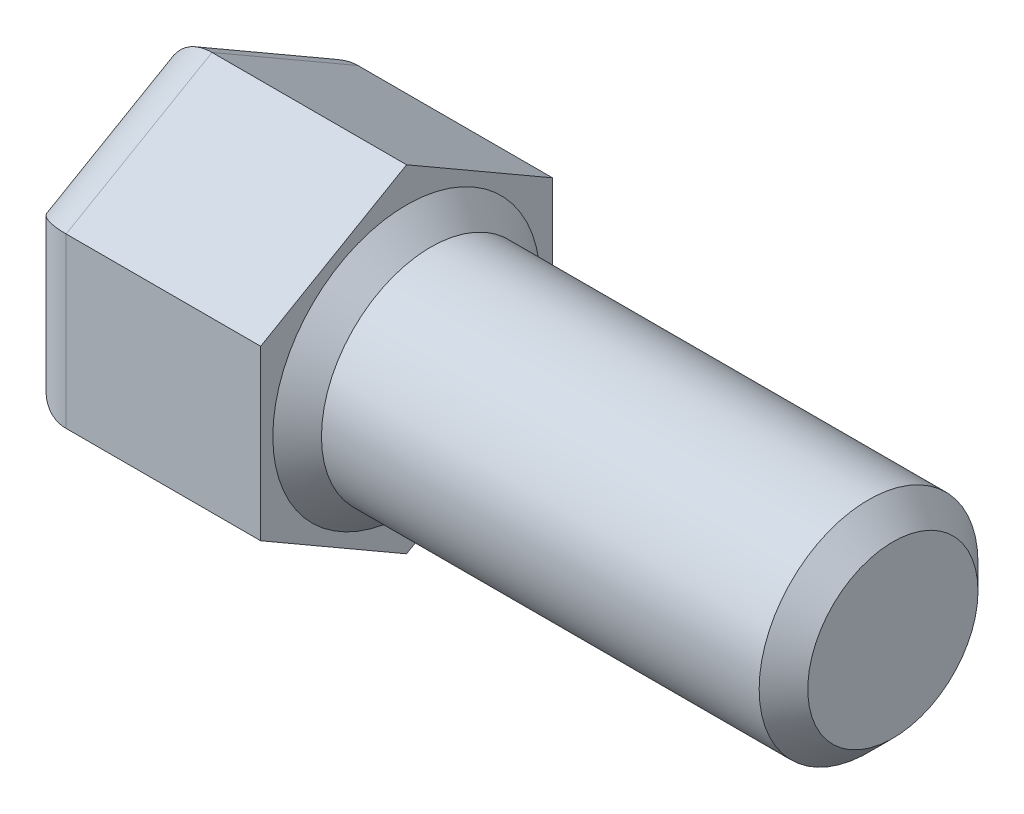
ISO-10303-21;
HEADER;
FILE_DESCRIPTION(('STEP AP214'),'2;1');
FILE_NAME('part.step','',(''),(''),'','','');
FILE_SCHEMA(('AUTOMOTIVE_DESIGN { 1 0 10303 214 1 1 1 1 }'));
ENDSEC;
DATA;
#1=APPLICATION_CONTEXT('core data for automotive mechanical design processes');
#2=APPLICATION_PROTOCOL_DEFINITION('international standard','automotive_design',2000,#1);
#3=PRODUCT_CONTEXT('',#1,'mechanical');
#4=PRODUCT('Part','Part','',(#3));
#5=PRODUCT_RELATED_PRODUCT_CATEGORY('part','',(#4));
#6=PRODUCT_DEFINITION_FORMATION('','',#4);
#7=PRODUCT_DEFINITION_CONTEXT('part definition',#1,'design');
#8=PRODUCT_DEFINITION('design','',#6,#7);
#9=PRODUCT_DEFINITION_SHAPE('','',#8);
#10=(LENGTH_UNIT() NAMED_UNIT(*) SI_UNIT(.MILLI.,.METRE.));
#11=(NAMED_UNIT(*) PLANE_ANGLE_UNIT() SI_UNIT($,.RADIAN.));
#12=(NAMED_UNIT(*) SI_UNIT($,.STERADIAN.) SOLID_ANGLE_UNIT());
#13=UNCERTAINTY_MEASURE_WITH_UNIT(LENGTH_MEASURE(1.E-05),#10,'distance_accuracy_value','');
#14=(GEOMETRIC_REPRESENTATION_CONTEXT(3) GLOBAL_UNCERTAINTY_ASSIGNED_CONTEXT((#13)) GLOBAL_UNIT_ASSIGNED_CONTEXT((#10,
#11,#12)) REPRESENTATION_CONTEXT('',''));
#15=CARTESIAN_POINT('',(0.,0.,0.));
#16=DIRECTION('',(0.,0.,1.));
#17=DIRECTION('',(1.,0.,0.));
#18=AXIS2_PLACEMENT_3D('',#15,#16,#17);
#19=CARTESIAN_POINT('',(10.,3.46410161513776,6.));
#20=DIRECTION('',(0.,-0.866025403784439,-0.5));
#21=DIRECTION('',(0.,0.5,-0.866025403784439));
#22=AXIS2_PLACEMENT_3D('',#19,#20,#21);
#23=PLANE('',#22);
#24=DIRECTION('',(-1.,0.,0.));
#25=VECTOR('',#24,1.);
#26=CARTESIAN_POINT('',(10.,6.92820323027551,0.));
#27=LINE('',#26,#25);
#28=CARTESIAN_POINT('',(10.,6.92820323027551,0.));
#29=VERTEX_POINT('',#28);
#30=CARTESIAN_POINT('',(2.,6.92820323027551,0.));
#31=VERTEX_POINT('',#30);
#32=EDGE_CURVE('E257',#29,#31,#27,.T.);
#33=ORIENTED_EDGE('',*,*,#32,.T.);
#34=DIRECTION('',(0.,-0.5,0.866025403784439));
#35=VECTOR('',#34,1.);
#36=CARTESIAN_POINT('',(2.,3.46410161513776,6.));
#37=LINE('',#36,#35);
#38=CARTESIAN_POINT('',(2.,3.46410161513776,6.));
#39=VERTEX_POINT('',#38);
#40=EDGE_CURVE('E50',#31,#39,#37,.T.);
#41=ORIENTED_EDGE('',*,*,#40,.T.);
#42=DIRECTION('',(-1.,0.,0.));
#43=VECTOR('',#42,1.);
#44=CARTESIAN_POINT('',(10.,3.46410161513776,6.));
#45=LINE('',#44,#43);
#46=CARTESIAN_POINT('',(10.,3.46410161513776,6.));
#47=VERTEX_POINT('',#46);
#48=EDGE_CURVE('E111',#47,#39,#45,.T.);
#49=ORIENTED_EDGE('',*,*,#48,.F.);
#50=DIRECTION('',(0.,-0.5,0.866025403784439));
#51=VECTOR('',#50,1.);
#52=CARTESIAN_POINT('',(10.,3.46410161513776,6.));
#53=LINE('',#52,#51);
#54=EDGE_CURVE('E118',#29,#47,#53,.T.);
#55=ORIENTED_EDGE('',*,*,#54,.F.);
#56=EDGE_LOOP('',(#33,#41,#49,#55));
#57=FACE_BOUND('',#56,.T.);
#58=ADVANCED_FACE('F35',(#57),#23,.F.);
#59=CARTESIAN_POINT('',(10.,-3.46410161513776,6.));
#60=DIRECTION('',(0.,0.,-1.));
#61=DIRECTION('',(0.,1.,0.));
#62=AXIS2_PLACEMENT_3D('',#59,#60,#61);
#63=PLANE('',#62);
#64=ORIENTED_EDGE('',*,*,#48,.T.);
#65=DIRECTION('',(0.,-1.,0.));
#66=VECTOR('',#65,1.);
#67=CARTESIAN_POINT('',(2.,-3.46410161513776,6.));
#68=LINE('',#67,#66);
#69=CARTESIAN_POINT('',(2.,-3.46410161513776,6.));
#70=VERTEX_POINT('',#69);
#71=EDGE_CURVE('E153',#39,#70,#68,.T.);
#72=ORIENTED_EDGE('',*,*,#71,.T.);
#73=DIRECTION('',(-1.,0.,0.));
#74=VECTOR('',#73,1.);
#75=CARTESIAN_POINT('',(10.,-3.46410161513776,6.));
#76=LINE('',#75,#74);
#77=CARTESIAN_POINT('',(10.,-3.46410161513776,6.));
#78=VERTEX_POINT('',#77);
#79=EDGE_CURVE('E114',#78,#70,#76,.T.);
#80=ORIENTED_EDGE('',*,*,#79,.F.);
#81=DIRECTION('',(0.,-1.,0.));
#82=VECTOR('',#81,1.);
#83=CARTESIAN_POINT('',(10.,-3.46410161513776,6.));
#84=LINE('',#83,#82);
#85=EDGE_CURVE('E108',#47,#78,#84,.T.);
#86=ORIENTED_EDGE('',*,*,#85,.F.);
#87=EDGE_LOOP('',(#64,#72,#80,#86));
#88=FACE_BOUND('',#87,.T.);
#89=ADVANCED_FACE('F110',(#88),#63,.F.);
#90=CARTESIAN_POINT('',(10.,-6.92820323027551,0.));
#91=DIRECTION('',(0.,0.866025403784439,-0.5));
#92=DIRECTION('',(0.,0.5,0.866025403784439));
#93=AXIS2_PLACEMENT_3D('',#90,#91,#92);
#94=PLANE('',#93);
#95=ORIENTED_EDGE('',*,*,#79,.T.);
#96=DIRECTION('',(0.,-0.5,-0.866025403784439));
#97=VECTOR('',#96,1.);
#98=CARTESIAN_POINT('',(2.,-6.92820323027551,0.));
#99=LINE('',#98,#97);
#100=CARTESIAN_POINT('',(2.,-6.92820323027551,0.));
#101=VERTEX_POINT('',#100);
#102=EDGE_CURVE('E126',#70,#101,#99,.T.);
#103=ORIENTED_EDGE('',*,*,#102,.T.);
#104=DIRECTION('',(-1.,0.,0.));
#105=VECTOR('',#104,1.);
#106=CARTESIAN_POINT('',(10.,-6.92820323027551,0.));
#107=LINE('',#106,#105);
#108=CARTESIAN_POINT('',(10.,-6.92820323027551,0.));
#109=VERTEX_POINT('',#108);
#110=EDGE_CURVE('E131',#109,#101,#107,.T.);
#111=ORIENTED_EDGE('',*,*,#110,.F.);
#112=DIRECTION('',(0.,-0.5,-0.866025403784439));
#113=VECTOR('',#112,1.);
#114=CARTESIAN_POINT('',(10.,-6.92820323027551,0.));
#115=LINE('',#114,#113);
#116=EDGE_CURVE('E117',#78,#109,#115,.T.);
#117=ORIENTED_EDGE('',*,*,#116,.F.);
#118=EDGE_LOOP('',(#95,#103,#111,#117));
#119=FACE_BOUND('',#118,.T.);
#120=ADVANCED_FACE('F211',(#119),#94,.F.);
#121=CARTESIAN_POINT('',(10.,-3.46410161513775,-6.));
#122=DIRECTION('',(0.,0.866025403784438,0.5));
#123=DIRECTION('',(0.,-0.5,0.866025403784438));
#124=AXIS2_PLACEMENT_3D('',#121,#122,#123);
#125=PLANE('',#124);
#126=ORIENTED_EDGE('',*,*,#110,.T.);
#127=DIRECTION('',(0.,0.5,-0.866025403784438));
#128=VECTOR('',#127,1.);
#129=CARTESIAN_POINT('',(2.,-3.46410161513775,-6.));
#130=LINE('',#129,#128);
#131=CARTESIAN_POINT('',(2.,-3.46410161513775,-6.));
#132=VERTEX_POINT('',#131);
#133=EDGE_CURVE('E147',#101,#132,#130,.T.);
#134=ORIENTED_EDGE('',*,*,#133,.T.);
#135=DIRECTION('',(-1.,0.,0.));
#136=VECTOR('',#135,1.);
#137=CARTESIAN_POINT('',(10.,-3.46410161513775,-6.));
#138=LINE('',#137,#136);
#139=CARTESIAN_POINT('',(10.,-3.46410161513775,-6.));
#140=VERTEX_POINT('',#139);
#141=EDGE_CURVE('E261',#140,#132,#138,.T.);
#142=ORIENTED_EDGE('',*,*,#141,.F.);
#143=DIRECTION('',(0.,0.5,-0.866025403784439));
#144=VECTOR('',#143,1.);
#145=CARTESIAN_POINT('',(10.,-3.46410161513775,-6.));
#146=LINE('',#145,#144);
#147=EDGE_CURVE('E250',#109,#140,#146,.T.);
#148=ORIENTED_EDGE('',*,*,#147,.F.);
#149=EDGE_LOOP('',(#126,#134,#142,#148));
#150=FACE_BOUND('',#149,.T.);
#151=ADVANCED_FACE('F264',(#150),#125,.F.);
#152=CARTESIAN_POINT('',(10.,3.46410161513776,-6.));
#153=DIRECTION('',(0.,0.,1.));
#154=DIRECTION('',(1.,0.,0.));
#155=AXIS2_PLACEMENT_3D('',#152,#153,#154);
#156=PLANE('',#155);
#157=ORIENTED_EDGE('',*,*,#141,.T.);
#158=DIRECTION('',(0.,1.,0.));
#159=VECTOR('',#158,1.);
#160=CARTESIAN_POINT('',(2.,3.46410161513776,-6.));
#161=LINE('',#160,#159);
#162=CARTESIAN_POINT('',(2.,3.46410161513776,-6.));
#163=VERTEX_POINT('',#162);
#164=EDGE_CURVE('E149',#132,#163,#161,.T.);
#165=ORIENTED_EDGE('',*,*,#164,.T.);
#166=DIRECTION('',(-1.,0.,0.));
#167=VECTOR('',#166,1.);
#168=CARTESIAN_POINT('',(10.,3.46410161513776,-6.));
#169=LINE('',#168,#167);
#170=CARTESIAN_POINT('',(10.,3.46410161513776,-6.));
#171=VERTEX_POINT('',#170);
#172=EDGE_CURVE('E259',#171,#163,#169,.T.);
#173=ORIENTED_EDGE('',*,*,#172,.F.);
#174=DIRECTION('',(0.,1.,0.));
#175=VECTOR('',#174,1.);
#176=CARTESIAN_POINT('',(10.,3.46410161513776,-6.));
#177=LINE('',#176,#175);
#178=EDGE_CURVE('E252',#140,#171,#177,.T.);
#179=ORIENTED_EDGE('',*,*,#178,.F.);
#180=EDGE_LOOP('',(#157,#165,#173,#179));
#181=FACE_BOUND('',#180,.T.);
#182=ADVANCED_FACE('F270',(#181),#156,.F.);
#183=CARTESIAN_POINT('',(10.,6.92820323027551,0.));
#184=DIRECTION('',(0.,-0.866025403784439,0.5));
#185=DIRECTION('',(0.,-0.5,-0.866025403784439));
#186=AXIS2_PLACEMENT_3D('',#183,#184,#185);
#187=PLANE('',#186);
#188=ORIENTED_EDGE('',*,*,#172,.T.);
#189=DIRECTION('',(0.,0.5,0.866025403784439));
#190=VECTOR('',#189,1.);
#191=CARTESIAN_POINT('',(2.,6.92820323027551,0.));
#192=LINE('',#191,#190);
#193=EDGE_CURVE('E58',#163,#31,#192,.T.);
#194=ORIENTED_EDGE('',*,*,#193,.T.);
#195=ORIENTED_EDGE('',*,*,#32,.F.);
#196=DIRECTION('',(0.,0.5,0.866025403784439));
#197=VECTOR('',#196,1.);
#198=CARTESIAN_POINT('',(10.,6.92820323027551,0.));
#199=LINE('',#198,#197);
#200=EDGE_CURVE('E123',#171,#29,#199,.T.);
#201=ORIENTED_EDGE('',*,*,#200,.F.);
#202=EDGE_LOOP('',(#188,#194,#195,#201));
#203=FACE_BOUND('',#202,.T.);
#204=ADVANCED_FACE('F272',(#203),#187,.F.);
#205=CARTESIAN_POINT('',(10.,0.,0.));
#206=DIRECTION('',(-1.,0.,0.));
#207=DIRECTION('',(0.,0.,1.));
#208=AXIS2_PLACEMENT_3D('',#205,#206,#207);
#209=PLANE('',#208);
#210=CARTESIAN_POINT('',(10.,0.,0.));
#211=DIRECTION('',(-1.,0.,0.));
#212=DIRECTION('',(0.,0.,1.));
#213=AXIS2_PLACEMENT_3D('',#210,#211,#212);
#214=CIRCLE('',#213,5.5);
#215=CARTESIAN_POINT('',(10.,0.,5.5));
#216=VERTEX_POINT('',#215);
#217=EDGE_CURVE('E43',#216,#216,#214,.T.);
#218=ORIENTED_EDGE('',*,*,#217,.T.);
#219=EDGE_LOOP('',(#218));
#220=FACE_BOUND('',#219,.T.);
#221=ORIENTED_EDGE('',*,*,#54,.T.);
#222=ORIENTED_EDGE('',*,*,#85,.T.);
#223=ORIENTED_EDGE('',*,*,#116,.T.);
#224=ORIENTED_EDGE('',*,*,#147,.T.);
#225=ORIENTED_EDGE('',*,*,#178,.T.);
#226=ORIENTED_EDGE('',*,*,#200,.T.);
#227=EDGE_LOOP('',(#221,#222,#223,#224,#225,#226));
#228=FACE_BOUND('',#227,.T.);
#229=ADVANCED_FACE('F121',(#220,#228),#209,.F.);
#230=CARTESIAN_POINT('',(0.,0.,0.));
#231=DIRECTION('',(-1.,0.,0.));
#232=DIRECTION('',(0.,0.,1.));
#233=AXIS2_PLACEMENT_3D('',#230,#231,#232);
#234=PLANE('',#233);
#235=DIRECTION('',(0.,0.5,-0.866025403784438));
#236=VECTOR('',#235,1.);
#237=CARTESIAN_POINT('',(0.,-5.19615242270663,1.));
#238=LINE('',#237,#236);
#239=CARTESIAN_POINT('',(0.,-2.3094010767585,-4.));
#240=VERTEX_POINT('',#239);
#241=CARTESIAN_POINT('',(0.,-4.61880215351701,0.));
#242=VERTEX_POINT('',#241);
#243=EDGE_CURVE('E142',#240,#242,#238,.F.);
#244=ORIENTED_EDGE('',*,*,#243,.T.);
#245=DIRECTION('',(0.,-0.5,-0.866025403784439));
#246=VECTOR('',#245,1.);
#247=CARTESIAN_POINT('',(0.,-1.73205080756888,5.));
#248=LINE('',#247,#246);
#249=CARTESIAN_POINT('',(0.,-2.3094010767585,4.));
#250=VERTEX_POINT('',#249);
#251=EDGE_CURVE('E144',#242,#250,#248,.F.);
#252=ORIENTED_EDGE('',*,*,#251,.T.);
#253=DIRECTION('',(0.,-1.,0.));
#254=VECTOR('',#253,1.);
#255=CARTESIAN_POINT('',(0.,3.46410161513776,4.));
#256=LINE('',#255,#254);
#257=CARTESIAN_POINT('',(0.,2.30940107675851,4.));
#258=VERTEX_POINT('',#257);
#259=EDGE_CURVE('E129',#250,#258,#256,.F.);
#260=ORIENTED_EDGE('',*,*,#259,.T.);
#261=DIRECTION('',(0.,-0.5,0.866025403784439));
#262=VECTOR('',#261,1.);
#263=CARTESIAN_POINT('',(0.,5.19615242270663,-1.));
#264=LINE('',#263,#262);
#265=CARTESIAN_POINT('',(0.,4.61880215351701,0.));
#266=VERTEX_POINT('',#265);
#267=EDGE_CURVE('E136',#258,#266,#264,.F.);
#268=ORIENTED_EDGE('',*,*,#267,.T.);
#269=DIRECTION('',(0.,0.5,0.866025403784439));
#270=VECTOR('',#269,1.);
#271=CARTESIAN_POINT('',(0.,1.73205080756888,-5.));
#272=LINE('',#271,#270);
#273=CARTESIAN_POINT('',(0.,2.3094010767585,-4.));
#274=VERTEX_POINT('',#273);
#275=EDGE_CURVE('E138',#266,#274,#272,.F.);
#276=ORIENTED_EDGE('',*,*,#275,.T.);
#277=DIRECTION('',(0.,1.,0.));
#278=VECTOR('',#277,1.);
#279=CARTESIAN_POINT('',(0.,-3.46410161513775,-4.));
#280=LINE('',#279,#278);
#281=EDGE_CURVE('E140',#274,#240,#280,.F.);
#282=ORIENTED_EDGE('',*,*,#281,.T.);
#283=EDGE_LOOP('',(#244,#252,#260,#268,#276,#282));
#284=FACE_BOUND('',#283,.T.);
#285=ADVANCED_FACE('F189',(#284),#234,.T.);
#286=CARTESIAN_POINT('',(30.,0.,0.));
#287=DIRECTION('',(-1.,0.,0.));
#288=DIRECTION('',(0.,0.,1.));
#289=AXIS2_PLACEMENT_3D('',#286,#287,#288);
#290=CYLINDRICAL_SURFACE('',#289,4.5);
#291=CARTESIAN_POINT('',(11.,0.,0.));
#292=DIRECTION('',(-1.,0.,0.));
#293=DIRECTION('',(0.,0.,1.));
#294=AXIS2_PLACEMENT_3D('',#291,#292,#293);
#295=CIRCLE('',#294,4.5);
#296=CARTESIAN_POINT('',(11.,0.,4.5));
#297=VERTEX_POINT('',#296);
#298=EDGE_CURVE('E173',#297,#297,#295,.F.);
#299=ORIENTED_EDGE('',*,*,#298,.T.);
#300=EDGE_LOOP('',(#299));
#301=FACE_BOUND('',#300,.T.);
#302=CARTESIAN_POINT('',(29.,0.,0.));
#303=DIRECTION('',(1.,0.,0.));
#304=DIRECTION('',(0.,0.,-1.));
#305=AXIS2_PLACEMENT_3D('',#302,#303,#304);
#306=CIRCLE('',#305,4.5);
#307=CARTESIAN_POINT('',(29.,0.,-4.5));
#308=VERTEX_POINT('',#307);
#309=EDGE_CURVE('E155',#308,#308,#306,.F.);
#310=ORIENTED_EDGE('',*,*,#309,.T.);
#311=EDGE_LOOP('',(#310));
#312=FACE_BOUND('',#311,.T.);
#313=ADVANCED_FACE('F185',(#301,#312),#290,.T.);
#314=CARTESIAN_POINT('',(30.,0.,0.));
#315=DIRECTION('',(1.,0.,0.));
#316=DIRECTION('',(0.,0.,-1.));
#317=AXIS2_PLACEMENT_3D('',#314,#315,#316);
#318=PLANE('',#317);
#319=CARTESIAN_POINT('',(30.,0.,0.));
#320=DIRECTION('',(1.,0.,0.));
#321=DIRECTION('',(0.,0.,-1.));
#322=AXIS2_PLACEMENT_3D('',#319,#320,#321);
#323=CIRCLE('',#322,3.5);
#324=CARTESIAN_POINT('',(30.,0.,-3.5));
#325=VERTEX_POINT('',#324);
#326=EDGE_CURVE('E11',#325,#325,#323,.T.);
#327=ORIENTED_EDGE('',*,*,#326,.T.);
#328=EDGE_LOOP('',(#327));
#329=FACE_BOUND('',#328,.T.);
#330=ADVANCED_FACE('F188',(#329),#318,.T.);
#331=CARTESIAN_POINT('',(2.,5.19615242270663,1.));
#332=DIRECTION('',(0.,-0.5,-0.866025403784439));
#333=DIRECTION('',(0.,0.866025403784439,-0.5));
#334=AXIS2_PLACEMENT_3D('',#331,#332,#333);
#335=CYLINDRICAL_SURFACE('',#334,2.);
#336=CARTESIAN_POINT('',(2.,2.3094010767585,-4.));
#337=DIRECTION('',(0.,-0.866025403784439,-0.5));
#338=DIRECTION('',(0.,0.5,-0.866025403784439));
#339=AXIS2_PLACEMENT_3D('',#336,#337,#338);
#340=ELLIPSE('',#339,2.3094010767585,2.);
#341=EDGE_CURVE('E166',#274,#163,#340,.T.);
#342=ORIENTED_EDGE('',*,*,#341,.F.);
#343=ORIENTED_EDGE('',*,*,#275,.F.);
#344=CARTESIAN_POINT('',(2.,4.61880215351701,0.));
#345=DIRECTION('',(0.,0.,-1.));
#346=DIRECTION('',(0.,1.,0.));
#347=AXIS2_PLACEMENT_3D('',#344,#345,#346);
#348=ELLIPSE('',#347,2.3094010767585,2.);
#349=EDGE_CURVE('E124',#31,#266,#348,.F.);
#350=ORIENTED_EDGE('',*,*,#349,.F.);
#351=ORIENTED_EDGE('',*,*,#193,.F.);
#352=EDGE_LOOP('',(#342,#343,#350,#351));
#353=FACE_BOUND('',#352,.T.);
#354=ADVANCED_FACE('F198',(#353),#335,.T.);
#355=CARTESIAN_POINT('',(2.,1.73205080756888,5.));
#356=DIRECTION('',(0.,0.5,-0.866025403784439));
#357=DIRECTION('',(0.,0.866025403784439,0.5));
#358=AXIS2_PLACEMENT_3D('',#355,#356,#357);
#359=CYLINDRICAL_SURFACE('',#358,2.);
#360=ORIENTED_EDGE('',*,*,#349,.T.);
#361=ORIENTED_EDGE('',*,*,#267,.F.);
#362=CARTESIAN_POINT('',(2.,2.30940107675851,4.));
#363=DIRECTION('',(0.,0.866025403784439,-0.5));
#364=DIRECTION('',(0.,0.5,0.866025403784438));
#365=AXIS2_PLACEMENT_3D('',#362,#363,#364);
#366=ELLIPSE('',#365,2.3094010767585,2.);
#367=EDGE_CURVE('E163',#39,#258,#366,.F.);
#368=ORIENTED_EDGE('',*,*,#367,.F.);
#369=ORIENTED_EDGE('',*,*,#40,.F.);
#370=EDGE_LOOP('',(#360,#361,#368,#369));
#371=FACE_BOUND('',#370,.T.);
#372=ADVANCED_FACE('F203',(#371),#359,.T.);
#373=CARTESIAN_POINT('',(2.,3.46410161513776,-4.));
#374=DIRECTION('',(0.,-1.,0.));
#375=DIRECTION('',(0.,0.,-1.));
#376=AXIS2_PLACEMENT_3D('',#373,#374,#375);
#377=CYLINDRICAL_SURFACE('',#376,2.);
#378=ORIENTED_EDGE('',*,*,#341,.T.);
#379=ORIENTED_EDGE('',*,*,#164,.F.);
#380=CARTESIAN_POINT('',(2.,-2.3094010767585,-4.));
#381=DIRECTION('',(0.,-0.866025403784439,0.5));
#382=DIRECTION('',(0.,-0.5,-0.866025403784439));
#383=AXIS2_PLACEMENT_3D('',#380,#381,#382);
#384=ELLIPSE('',#383,2.3094010767585,2.);
#385=EDGE_CURVE('E160',#240,#132,#384,.T.);
#386=ORIENTED_EDGE('',*,*,#385,.F.);
#387=ORIENTED_EDGE('',*,*,#281,.F.);
#388=EDGE_LOOP('',(#378,#379,#386,#387));
#389=FACE_BOUND('',#388,.T.);
#390=ADVANCED_FACE('F225',(#389),#377,.T.);
#391=CARTESIAN_POINT('',(2.,-3.46410161513776,4.));
#392=DIRECTION('',(0.,1.,0.));
#393=DIRECTION('',(0.,0.,1.));
#394=AXIS2_PLACEMENT_3D('',#391,#392,#393);
#395=CYLINDRICAL_SURFACE('',#394,2.);
#396=ORIENTED_EDGE('',*,*,#367,.T.);
#397=ORIENTED_EDGE('',*,*,#259,.F.);
#398=CARTESIAN_POINT('',(2.,-2.3094010767585,4.));
#399=DIRECTION('',(0.,0.866025403784439,0.5));
#400=DIRECTION('',(0.,0.5,-0.866025403784439));
#401=AXIS2_PLACEMENT_3D('',#398,#399,#400);
#402=ELLIPSE('',#401,2.3094010767585,2.);
#403=EDGE_CURVE('E158',#70,#250,#402,.F.);
#404=ORIENTED_EDGE('',*,*,#403,.F.);
#405=ORIENTED_EDGE('',*,*,#71,.F.);
#406=EDGE_LOOP('',(#396,#397,#404,#405));
#407=FACE_BOUND('',#406,.T.);
#408=ADVANCED_FACE('F221',(#407),#395,.T.);
#409=CARTESIAN_POINT('',(2.,-1.73205080756888,-5.));
#410=DIRECTION('',(0.,-0.5,0.866025403784438));
#411=DIRECTION('',(0.,-0.866025403784438,-0.5));
#412=AXIS2_PLACEMENT_3D('',#409,#410,#411);
#413=CYLINDRICAL_SURFACE('',#412,2.);
#414=ORIENTED_EDGE('',*,*,#385,.T.);
#415=ORIENTED_EDGE('',*,*,#133,.F.);
#416=CARTESIAN_POINT('',(2.,-4.61880215351701,0.));
#417=DIRECTION('',(0.,0.,1.));
#418=DIRECTION('',(0.,-1.,0.));
#419=AXIS2_PLACEMENT_3D('',#416,#417,#418);
#420=ELLIPSE('',#419,2.3094010767585,2.);
#421=EDGE_CURVE('E156',#242,#101,#420,.T.);
#422=ORIENTED_EDGE('',*,*,#421,.F.);
#423=ORIENTED_EDGE('',*,*,#243,.F.);
#424=EDGE_LOOP('',(#414,#415,#422,#423));
#425=FACE_BOUND('',#424,.T.);
#426=ADVANCED_FACE('F217',(#425),#413,.T.);
#427=CARTESIAN_POINT('',(2.,-5.19615242270663,-1.));
#428=DIRECTION('',(0.,0.5,0.866025403784439));
#429=DIRECTION('',(0.,-0.866025403784439,0.5));
#430=AXIS2_PLACEMENT_3D('',#427,#428,#429);
#431=CYLINDRICAL_SURFACE('',#430,2.);
#432=ORIENTED_EDGE('',*,*,#403,.T.);
#433=ORIENTED_EDGE('',*,*,#251,.F.);
#434=ORIENTED_EDGE('',*,*,#421,.T.);
#435=ORIENTED_EDGE('',*,*,#102,.F.);
#436=EDGE_LOOP('',(#432,#433,#434,#435));
#437=FACE_BOUND('',#436,.T.);
#438=ADVANCED_FACE('F182',(#437),#431,.T.);
#439=CARTESIAN_POINT('',(11.,0.,0.));
#440=DIRECTION('',(-1.,0.,0.));
#441=DIRECTION('',(0.,0.,1.));
#442=AXIS2_PLACEMENT_3D('',#439,#440,#441);
#443=CONICAL_SURFACE('',#442,4.5,0.785398163397448);
#444=ORIENTED_EDGE('',*,*,#217,.F.);
#445=EDGE_LOOP('',(#444));
#446=FACE_BOUND('',#445,.T.);
#447=ORIENTED_EDGE('',*,*,#298,.F.);
#448=EDGE_LOOP('',(#447));
#449=FACE_BOUND('',#448,.T.);
#450=ADVANCED_FACE('F179',(#446,#449),#443,.T.);
#451=CARTESIAN_POINT('',(30.,0.,0.));
#452=DIRECTION('',(-1.,0.,0.));
#453=DIRECTION('',(0.,0.,1.));
#454=AXIS2_PLACEMENT_3D('',#451,#452,#453);
#455=CONICAL_SURFACE('',#454,3.5,0.785398163397447);
#456=ORIENTED_EDGE('',*,*,#309,.F.);
#457=EDGE_LOOP('',(#456));
#458=FACE_BOUND('',#457,.T.);
#459=ORIENTED_EDGE('',*,*,#326,.F.);
#460=EDGE_LOOP('',(#459));
#461=FACE_BOUND('',#460,.T.);
#462=ADVANCED_FACE('F37',(#458,#461),#455,.T.);
#463=CLOSED_SHELL('',(#58,#89,#120,#151,#182,#204,#229,#285,#313,#330,#354,#372,#390,#408,#426,
#438,#450,#462));
#464=MANIFOLD_SOLID_BREP('B2',#463);
#465=ADVANCED_BREP_SHAPE_REPRESENTATION('',(#18,#464),#14);
#466=SHAPE_DEFINITION_REPRESENTATION(#9,#465);
ENDSEC;
END-ISO-10303-21;
